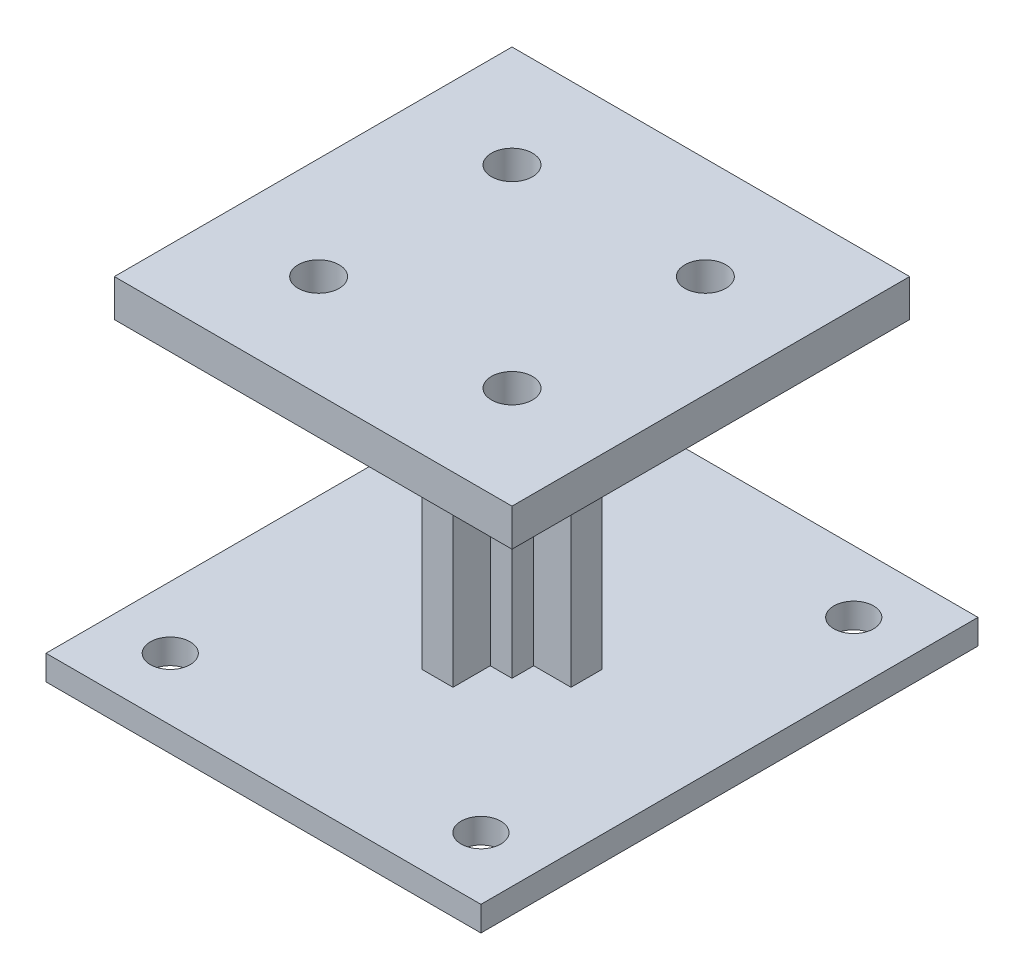
ISO-10303-21;
HEADER;
FILE_DESCRIPTION(('STEP AP214'),'2;1');
FILE_NAME('part.step','',(''),(''),'','','');
FILE_SCHEMA(('AUTOMOTIVE_DESIGN { 1 0 10303 214 1 1 1 1 }'));
ENDSEC;
DATA;
#1=APPLICATION_CONTEXT('core data for automotive mechanical design processes');
#2=APPLICATION_PROTOCOL_DEFINITION('international standard','automotive_design',2000,#1);
#3=PRODUCT_CONTEXT('',#1,'mechanical');
#4=PRODUCT('Part','Part','',(#3));
#5=PRODUCT_RELATED_PRODUCT_CATEGORY('part','',(#4));
#6=PRODUCT_DEFINITION_FORMATION('','',#4);
#7=PRODUCT_DEFINITION_CONTEXT('part definition',#1,'design');
#8=PRODUCT_DEFINITION('design','',#6,#7);
#9=PRODUCT_DEFINITION_SHAPE('','',#8);
#10=(LENGTH_UNIT() NAMED_UNIT(*) SI_UNIT(.MILLI.,.METRE.));
#11=(NAMED_UNIT(*) PLANE_ANGLE_UNIT() SI_UNIT($,.RADIAN.));
#12=(NAMED_UNIT(*) SI_UNIT($,.STERADIAN.) SOLID_ANGLE_UNIT());
#13=UNCERTAINTY_MEASURE_WITH_UNIT(LENGTH_MEASURE(1.E-05),#10,'distance_accuracy_value','');
#14=(GEOMETRIC_REPRESENTATION_CONTEXT(3) GLOBAL_UNCERTAINTY_ASSIGNED_CONTEXT((#13)) GLOBAL_UNIT_ASSIGNED_CONTEXT((#10,
#11,#12)) REPRESENTATION_CONTEXT('',''));
#15=CARTESIAN_POINT('',(0.,0.,0.));
#16=DIRECTION('',(0.,0.,1.));
#17=DIRECTION('',(1.,0.,0.));
#18=AXIS2_PLACEMENT_3D('',#15,#16,#17);
#19=CARTESIAN_POINT('',(0.,2.,0.));
#20=DIRECTION('',(0.,-1.,0.));
#21=DIRECTION('',(0.,0.,-1.));
#22=AXIS2_PLACEMENT_3D('',#19,#20,#21);
#23=PLANE('',#22);
#24=DIRECTION('',(0.,0.,-1.));
#25=VECTOR('',#24,1.);
#26=CARTESIAN_POINT('',(17.5,2.,20.));
#27=LINE('',#26,#25);
#28=CARTESIAN_POINT('',(17.5,2.,20.));
#29=VERTEX_POINT('',#28);
#30=CARTESIAN_POINT('',(17.5,2.,-20.));
#31=VERTEX_POINT('',#30);
#32=EDGE_CURVE('E536',#29,#31,#27,.T.);
#33=ORIENTED_EDGE('',*,*,#32,.T.);
#34=DIRECTION('',(-1.,0.,0.));
#35=VECTOR('',#34,1.);
#36=CARTESIAN_POINT('',(-17.5,2.,-20.));
#37=LINE('',#36,#35);
#38=CARTESIAN_POINT('',(-17.5,2.,-20.));
#39=VERTEX_POINT('',#38);
#40=EDGE_CURVE('E540',#31,#39,#37,.T.);
#41=ORIENTED_EDGE('',*,*,#40,.T.);
#42=DIRECTION('',(0.,0.,1.));
#43=VECTOR('',#42,1.);
#44=CARTESIAN_POINT('',(-17.5,2.,20.));
#45=LINE('',#44,#43);
#46=CARTESIAN_POINT('',(-17.5,2.,20.));
#47=VERTEX_POINT('',#46);
#48=EDGE_CURVE('E544',#39,#47,#45,.T.);
#49=ORIENTED_EDGE('',*,*,#48,.T.);
#50=DIRECTION('',(1.,0.,0.));
#51=VECTOR('',#50,1.);
#52=CARTESIAN_POINT('',(-17.5,2.,20.));
#53=LINE('',#52,#51);
#54=EDGE_CURVE('E547',#47,#29,#53,.T.);
#55=ORIENTED_EDGE('',*,*,#54,.T.);
#56=EDGE_LOOP('',(#33,#41,#49,#55));
#57=FACE_BOUND('',#56,.T.);
#58=CARTESIAN_POINT('',(-12.5,2.,-15.));
#59=DIRECTION('',(0.,1.,0.));
#60=DIRECTION('',(0.,0.,1.));
#61=AXIS2_PLACEMENT_3D('',#58,#59,#60);
#62=CIRCLE('',#61,1.6);
#63=CARTESIAN_POINT('',(-12.5,2.,-13.4));
#64=VERTEX_POINT('',#63);
#65=EDGE_CURVE('E508',#64,#64,#62,.T.);
#66=ORIENTED_EDGE('',*,*,#65,.F.);
#67=EDGE_LOOP('',(#66));
#68=FACE_BOUND('',#67,.T.);
#69=CARTESIAN_POINT('',(12.5,2.,-15.));
#70=DIRECTION('',(0.,1.,0.));
#71=DIRECTION('',(0.,0.,-1.));
#72=AXIS2_PLACEMENT_3D('',#69,#70,#71);
#73=CIRCLE('',#72,1.6);
#74=CARTESIAN_POINT('',(12.5,2.,-16.6));
#75=VERTEX_POINT('',#74);
#76=EDGE_CURVE('E504',#75,#75,#73,.T.);
#77=ORIENTED_EDGE('',*,*,#76,.F.);
#78=EDGE_LOOP('',(#77));
#79=FACE_BOUND('',#78,.T.);
#80=CARTESIAN_POINT('',(12.5,2.,15.));
#81=DIRECTION('',(0.,1.,0.));
#82=DIRECTION('',(0.,0.,1.));
#83=AXIS2_PLACEMENT_3D('',#80,#81,#82);
#84=CIRCLE('',#83,1.6);
#85=CARTESIAN_POINT('',(12.5,2.,16.6));
#86=VERTEX_POINT('',#85);
#87=EDGE_CURVE('E513',#86,#86,#84,.T.);
#88=ORIENTED_EDGE('',*,*,#87,.F.);
#89=EDGE_LOOP('',(#88));
#90=FACE_BOUND('',#89,.T.);
#91=CARTESIAN_POINT('',(-12.5,2.,15.));
#92=DIRECTION('',(0.,1.,0.));
#93=DIRECTION('',(0.,0.,-1.));
#94=AXIS2_PLACEMENT_3D('',#91,#92,#93);
#95=CIRCLE('',#94,1.6);
#96=CARTESIAN_POINT('',(-12.5,2.,13.4));
#97=VERTEX_POINT('',#96);
#98=EDGE_CURVE('E521',#97,#97,#95,.T.);
#99=ORIENTED_EDGE('',*,*,#98,.F.);
#100=EDGE_LOOP('',(#99));
#101=FACE_BOUND('',#100,.T.);
#102=DIRECTION('',(-1.,0.,0.));
#103=VECTOR('',#102,1.);
#104=CARTESIAN_POINT('',(6.,2.,-1.25000000000002));
#105=LINE('',#104,#103);
#106=CARTESIAN_POINT('',(6.,2.,-1.25000000000002));
#107=VERTEX_POINT('',#106);
#108=CARTESIAN_POINT('',(3.,2.,-1.25000000000002));
#109=VERTEX_POINT('',#108);
#110=EDGE_CURVE('E61',#107,#109,#105,.T.);
#111=ORIENTED_EDGE('',*,*,#110,.F.);
#112=DIRECTION('',(0.,0.,-1.));
#113=VECTOR('',#112,1.);
#114=CARTESIAN_POINT('',(6.,2.,1.24999999999998));
#115=LINE('',#114,#113);
#116=CARTESIAN_POINT('',(6.,2.,1.24999999999998));
#117=VERTEX_POINT('',#116);
#118=EDGE_CURVE('E65',#117,#107,#115,.T.);
#119=ORIENTED_EDGE('',*,*,#118,.F.);
#120=DIRECTION('',(-1.,0.,0.));
#121=VECTOR('',#120,1.);
#122=CARTESIAN_POINT('',(6.,2.,1.24999999999998));
#123=LINE('',#122,#121);
#124=CARTESIAN_POINT('',(3.,2.,1.24999999999999));
#125=VERTEX_POINT('',#124);
#126=EDGE_CURVE('E245',#117,#125,#123,.T.);
#127=ORIENTED_EDGE('',*,*,#126,.T.);
#128=DIRECTION('',(0.,0.,-1.));
#129=VECTOR('',#128,1.);
#130=CARTESIAN_POINT('',(3.,2.,3.));
#131=LINE('',#130,#129);
#132=CARTESIAN_POINT('',(3.,2.,3.));
#133=VERTEX_POINT('',#132);
#134=EDGE_CURVE('E231',#133,#125,#131,.T.);
#135=ORIENTED_EDGE('',*,*,#134,.F.);
#136=DIRECTION('',(1.,0.,0.));
#137=VECTOR('',#136,1.);
#138=CARTESIAN_POINT('',(-3.,2.,3.));
#139=LINE('',#138,#137);
#140=CARTESIAN_POINT('',(1.25,2.,3.));
#141=VERTEX_POINT('',#140);
#142=EDGE_CURVE('E484',#141,#133,#139,.T.);
#143=ORIENTED_EDGE('',*,*,#142,.F.);
#144=DIRECTION('',(0.,0.,-1.));
#145=VECTOR('',#144,1.);
#146=CARTESIAN_POINT('',(1.25,2.,6.));
#147=LINE('',#146,#145);
#148=CARTESIAN_POINT('',(1.25,2.,6.));
#149=VERTEX_POINT('',#148);
#150=EDGE_CURVE('E366',#149,#141,#147,.T.);
#151=ORIENTED_EDGE('',*,*,#150,.F.);
#152=DIRECTION('',(1.,0.,0.));
#153=VECTOR('',#152,1.);
#154=CARTESIAN_POINT('',(-1.25,2.,6.));
#155=LINE('',#154,#153);
#156=CARTESIAN_POINT('',(-1.25,2.,6.));
#157=VERTEX_POINT('',#156);
#158=EDGE_CURVE('E363',#157,#149,#155,.T.);
#159=ORIENTED_EDGE('',*,*,#158,.F.);
#160=DIRECTION('',(0.,0.,-1.));
#161=VECTOR('',#160,1.);
#162=CARTESIAN_POINT('',(-1.25,2.,6.));
#163=LINE('',#162,#161);
#164=CARTESIAN_POINT('',(-1.25,2.,3.));
#165=VERTEX_POINT('',#164);
#166=EDGE_CURVE('E373',#157,#165,#163,.T.);
#167=ORIENTED_EDGE('',*,*,#166,.T.);
#168=CARTESIAN_POINT('',(-3.,2.,3.));
#169=VERTEX_POINT('',#168);
#170=EDGE_CURVE('E485',#169,#165,#139,.T.);
#171=ORIENTED_EDGE('',*,*,#170,.F.);
#172=DIRECTION('',(0.,0.,1.));
#173=VECTOR('',#172,1.);
#174=CARTESIAN_POINT('',(-3.,2.,3.));
#175=LINE('',#174,#173);
#176=CARTESIAN_POINT('',(-3.,2.,1.25000000000006));
#177=VERTEX_POINT('',#176);
#178=EDGE_CURVE('E480',#177,#169,#175,.T.);
#179=ORIENTED_EDGE('',*,*,#178,.F.);
#180=DIRECTION('',(1.,0.,0.));
#181=VECTOR('',#180,1.);
#182=CARTESIAN_POINT('',(-5.99999999999999,2.,1.25000000000006));
#183=LINE('',#182,#181);
#184=CARTESIAN_POINT('',(-5.99999999999999,2.,1.25000000000006));
#185=VERTEX_POINT('',#184);
#186=EDGE_CURVE('E331',#185,#177,#183,.T.);
#187=ORIENTED_EDGE('',*,*,#186,.F.);
#188=DIRECTION('',(0.,0.,1.));
#189=VECTOR('',#188,1.);
#190=CARTESIAN_POINT('',(-6.00000000000001,2.,-1.24999999999994));
#191=LINE('',#190,#189);
#192=CARTESIAN_POINT('',(-6.00000000000001,2.,-1.24999999999994));
#193=VERTEX_POINT('',#192);
#194=EDGE_CURVE('E327',#193,#185,#191,.T.);
#195=ORIENTED_EDGE('',*,*,#194,.F.);
#196=DIRECTION('',(1.,0.,0.));
#197=VECTOR('',#196,1.);
#198=CARTESIAN_POINT('',(-6.00000000000001,2.,-1.24999999999994));
#199=LINE('',#198,#197);
#200=CARTESIAN_POINT('',(-3.00000000000001,2.,-1.24999999999997));
#201=VERTEX_POINT('',#200);
#202=EDGE_CURVE('E342',#193,#201,#199,.T.);
#203=ORIENTED_EDGE('',*,*,#202,.T.);
#204=CARTESIAN_POINT('',(-3.,2.,-3.));
#205=VERTEX_POINT('',#204);
#206=EDGE_CURVE('E481',#205,#201,#175,.T.);
#207=ORIENTED_EDGE('',*,*,#206,.F.);
#208=DIRECTION('',(-1.,0.,0.));
#209=VECTOR('',#208,1.);
#210=CARTESIAN_POINT('',(-3.,2.,-3.));
#211=LINE('',#210,#209);
#212=CARTESIAN_POINT('',(-1.25,2.,-3.));
#213=VERTEX_POINT('',#212);
#214=EDGE_CURVE('E241',#213,#205,#211,.T.);
#215=ORIENTED_EDGE('',*,*,#214,.F.);
#216=DIRECTION('',(0.,0.,1.));
#217=VECTOR('',#216,1.);
#218=CARTESIAN_POINT('',(-1.25,2.,-6.));
#219=LINE('',#218,#217);
#220=CARTESIAN_POINT('',(-1.25,2.,-6.));
#221=VERTEX_POINT('',#220);
#222=EDGE_CURVE('E292',#221,#213,#219,.T.);
#223=ORIENTED_EDGE('',*,*,#222,.F.);
#224=DIRECTION('',(-1.,0.,0.));
#225=VECTOR('',#224,1.);
#226=CARTESIAN_POINT('',(1.25,2.,-6.));
#227=LINE('',#226,#225);
#228=CARTESIAN_POINT('',(1.25,2.,-6.));
#229=VERTEX_POINT('',#228);
#230=EDGE_CURVE('E288',#229,#221,#227,.T.);
#231=ORIENTED_EDGE('',*,*,#230,.F.);
#232=DIRECTION('',(0.,0.,1.));
#233=VECTOR('',#232,1.);
#234=CARTESIAN_POINT('',(1.25,2.,-6.));
#235=LINE('',#234,#233);
#236=CARTESIAN_POINT('',(1.25,2.,-3.));
#237=VERTEX_POINT('',#236);
#238=EDGE_CURVE('E304',#229,#237,#235,.T.);
#239=ORIENTED_EDGE('',*,*,#238,.T.);
#240=CARTESIAN_POINT('',(3.,2.,-3.));
#241=VERTEX_POINT('',#240);
#242=EDGE_CURVE('E477',#241,#237,#211,.T.);
#243=ORIENTED_EDGE('',*,*,#242,.F.);
#244=EDGE_CURVE('E242',#109,#241,#131,.T.);
#245=ORIENTED_EDGE('',*,*,#244,.F.);
#246=EDGE_LOOP('',(#111,#119,#127,#135,#143,#151,#159,#167,#171,#179,#187,#195,#203,#207,#215,
#223,#231,#239,#243,#245));
#247=FACE_BOUND('',#246,.T.);
#248=ADVANCED_FACE('F45',(#57,#68,#79,#90,#101,#247),#23,.F.);
#249=CARTESIAN_POINT('',(0.,24.,0.));
#250=DIRECTION('',(0.,-1.,0.));
#251=DIRECTION('',(0.,0.,-1.));
#252=AXIS2_PLACEMENT_3D('',#249,#250,#251);
#253=PLANE('',#252);
#254=CARTESIAN_POINT('',(7.78,24.,7.78));
#255=DIRECTION('',(0.,1.,0.));
#256=DIRECTION('',(0.,0.,1.));
#257=AXIS2_PLACEMENT_3D('',#254,#255,#256);
#258=CIRCLE('',#257,1.65);
#259=CARTESIAN_POINT('',(7.78,24.,9.43000000000001));
#260=VERTEX_POINT('',#259);
#261=EDGE_CURVE('E389',#260,#260,#258,.T.);
#262=ORIENTED_EDGE('',*,*,#261,.T.);
#263=EDGE_LOOP('',(#262));
#264=FACE_BOUND('',#263,.T.);
#265=CARTESIAN_POINT('',(-7.78,24.,-7.78));
#266=DIRECTION('',(0.,1.,0.));
#267=DIRECTION('',(0.,0.,1.));
#268=AXIS2_PLACEMENT_3D('',#265,#266,#267);
#269=CIRCLE('',#268,1.65);
#270=CARTESIAN_POINT('',(-7.78,24.,-6.13));
#271=VERTEX_POINT('',#270);
#272=EDGE_CURVE('E405',#271,#271,#269,.T.);
#273=ORIENTED_EDGE('',*,*,#272,.T.);
#274=EDGE_LOOP('',(#273));
#275=FACE_BOUND('',#274,.T.);
#276=DIRECTION('',(0.,0.,-1.));
#277=VECTOR('',#276,1.);
#278=CARTESIAN_POINT('',(16.,24.,16.));
#279=LINE('',#278,#277);
#280=CARTESIAN_POINT('',(16.,24.,16.));
#281=VERTEX_POINT('',#280);
#282=CARTESIAN_POINT('',(16.,24.,-16.));
#283=VERTEX_POINT('',#282);
#284=EDGE_CURVE('E413',#281,#283,#279,.T.);
#285=ORIENTED_EDGE('',*,*,#284,.F.);
#286=DIRECTION('',(1.,0.,0.));
#287=VECTOR('',#286,1.);
#288=CARTESIAN_POINT('',(-16.,24.,16.));
#289=LINE('',#288,#287);
#290=CARTESIAN_POINT('',(-16.,24.,16.));
#291=VERTEX_POINT('',#290);
#292=EDGE_CURVE('E422',#291,#281,#289,.T.);
#293=ORIENTED_EDGE('',*,*,#292,.F.);
#294=DIRECTION('',(0.,0.,1.));
#295=VECTOR('',#294,1.);
#296=CARTESIAN_POINT('',(-16.,24.,16.));
#297=LINE('',#296,#295);
#298=CARTESIAN_POINT('',(-16.,24.,-16.));
#299=VERTEX_POINT('',#298);
#300=EDGE_CURVE('E438',#299,#291,#297,.T.);
#301=ORIENTED_EDGE('',*,*,#300,.F.);
#302=DIRECTION('',(-1.,0.,0.));
#303=VECTOR('',#302,1.);
#304=CARTESIAN_POINT('',(-16.,24.,-16.));
#305=LINE('',#304,#303);
#306=EDGE_CURVE('E435',#283,#299,#305,.T.);
#307=ORIENTED_EDGE('',*,*,#306,.F.);
#308=EDGE_LOOP('',(#285,#293,#301,#307));
#309=FACE_BOUND('',#308,.T.);
#310=CARTESIAN_POINT('',(7.78,24.,-7.78));
#311=DIRECTION('',(0.,1.,0.));
#312=DIRECTION('',(0.,0.,-1.));
#313=AXIS2_PLACEMENT_3D('',#310,#311,#312);
#314=CIRCLE('',#313,1.65);
#315=CARTESIAN_POINT('',(7.78,24.,-9.43000000000001));
#316=VERTEX_POINT('',#315);
#317=EDGE_CURVE('E397',#316,#316,#314,.T.);
#318=ORIENTED_EDGE('',*,*,#317,.T.);
#319=EDGE_LOOP('',(#318));
#320=FACE_BOUND('',#319,.T.);
#321=CARTESIAN_POINT('',(-7.78,24.,7.78));
#322=DIRECTION('',(0.,1.,0.));
#323=DIRECTION('',(0.,0.,-1.));
#324=AXIS2_PLACEMENT_3D('',#321,#322,#323);
#325=CIRCLE('',#324,1.65);
#326=CARTESIAN_POINT('',(-7.78,24.,6.13));
#327=VERTEX_POINT('',#326);
#328=EDGE_CURVE('E384',#327,#327,#325,.T.);
#329=ORIENTED_EDGE('',*,*,#328,.T.);
#330=EDGE_LOOP('',(#329));
#331=FACE_BOUND('',#330,.T.);
#332=DIRECTION('',(0.,0.,1.));
#333=VECTOR('',#332,1.);
#334=CARTESIAN_POINT('',(6.,24.,1.24999999999998));
#335=LINE('',#334,#333);
#336=CARTESIAN_POINT('',(6.,24.,-1.25000000000002));
#337=VERTEX_POINT('',#336);
#338=CARTESIAN_POINT('',(6.,24.,1.24999999999998));
#339=VERTEX_POINT('',#338);
#340=EDGE_CURVE('E260',#337,#339,#335,.T.);
#341=ORIENTED_EDGE('',*,*,#340,.F.);
#342=DIRECTION('',(-1.,0.,0.));
#343=VECTOR('',#342,1.);
#344=CARTESIAN_POINT('',(6.,24.,-1.25000000000002));
#345=LINE('',#344,#343);
#346=CARTESIAN_POINT('',(3.,24.,-1.25000000000002));
#347=VERTEX_POINT('',#346);
#348=EDGE_CURVE('E271',#337,#347,#345,.T.);
#349=ORIENTED_EDGE('',*,*,#348,.T.);
#350=DIRECTION('',(0.,0.,-1.));
#351=VECTOR('',#350,1.);
#352=CARTESIAN_POINT('',(3.,24.,3.));
#353=LINE('',#352,#351);
#354=CARTESIAN_POINT('',(3.,24.,-3.));
#355=VERTEX_POINT('',#354);
#356=EDGE_CURVE('E462',#347,#355,#353,.T.);
#357=ORIENTED_EDGE('',*,*,#356,.T.);
#358=DIRECTION('',(-1.,0.,0.));
#359=VECTOR('',#358,1.);
#360=CARTESIAN_POINT('',(-3.,24.,-3.));
#361=LINE('',#360,#359);
#362=CARTESIAN_POINT('',(1.25,24.,-3.));
#363=VERTEX_POINT('',#362);
#364=EDGE_CURVE('E463',#355,#363,#361,.T.);
#365=ORIENTED_EDGE('',*,*,#364,.T.);
#366=DIRECTION('',(0.,0.,1.));
#367=VECTOR('',#366,1.);
#368=CARTESIAN_POINT('',(1.25,24.,-6.));
#369=LINE('',#368,#367);
#370=CARTESIAN_POINT('',(1.25,24.,-6.));
#371=VERTEX_POINT('',#370);
#372=EDGE_CURVE('E308',#371,#363,#369,.T.);
#373=ORIENTED_EDGE('',*,*,#372,.F.);
#374=DIRECTION('',(1.,0.,0.));
#375=VECTOR('',#374,1.);
#376=CARTESIAN_POINT('',(1.25,24.,-6.));
#377=LINE('',#376,#375);
#378=CARTESIAN_POINT('',(-1.25,24.,-6.));
#379=VERTEX_POINT('',#378);
#380=EDGE_CURVE('E279',#379,#371,#377,.T.);
#381=ORIENTED_EDGE('',*,*,#380,.F.);
#382=DIRECTION('',(0.,0.,1.));
#383=VECTOR('',#382,1.);
#384=CARTESIAN_POINT('',(-1.25,24.,-6.));
#385=LINE('',#384,#383);
#386=CARTESIAN_POINT('',(-1.25,24.,-3.));
#387=VERTEX_POINT('',#386);
#388=EDGE_CURVE('E263',#379,#387,#385,.T.);
#389=ORIENTED_EDGE('',*,*,#388,.T.);
#390=CARTESIAN_POINT('',(-3.,24.,-3.));
#391=VERTEX_POINT('',#390);
#392=EDGE_CURVE('E461',#387,#391,#361,.T.);
#393=ORIENTED_EDGE('',*,*,#392,.T.);
#394=DIRECTION('',(0.,0.,1.));
#395=VECTOR('',#394,1.);
#396=CARTESIAN_POINT('',(-3.,24.,3.));
#397=LINE('',#396,#395);
#398=CARTESIAN_POINT('',(-3.,24.,-1.24999999999997));
#399=VERTEX_POINT('',#398);
#400=EDGE_CURVE('E468',#391,#399,#397,.T.);
#401=ORIENTED_EDGE('',*,*,#400,.T.);
#402=DIRECTION('',(1.,0.,0.));
#403=VECTOR('',#402,1.);
#404=CARTESIAN_POINT('',(-6.00000000000001,24.,-1.24999999999994));
#405=LINE('',#404,#403);
#406=CARTESIAN_POINT('',(-6.00000000000001,24.,-1.24999999999994));
#407=VERTEX_POINT('',#406);
#408=EDGE_CURVE('E346',#407,#399,#405,.T.);
#409=ORIENTED_EDGE('',*,*,#408,.F.);
#410=DIRECTION('',(0.,0.,-1.));
#411=VECTOR('',#410,1.);
#412=CARTESIAN_POINT('',(-6.00000000000001,24.,-1.24999999999994));
#413=LINE('',#412,#411);
#414=CARTESIAN_POINT('',(-5.99999999999999,24.,1.25000000000006));
#415=VERTEX_POINT('',#414);
#416=EDGE_CURVE('E318',#415,#407,#413,.T.);
#417=ORIENTED_EDGE('',*,*,#416,.F.);
#418=DIRECTION('',(1.,0.,0.));
#419=VECTOR('',#418,1.);
#420=CARTESIAN_POINT('',(-5.99999999999999,24.,1.25000000000006));
#421=LINE('',#420,#419);
#422=CARTESIAN_POINT('',(-3.,24.,1.25000000000006));
#423=VERTEX_POINT('',#422);
#424=EDGE_CURVE('E297',#415,#423,#421,.T.);
#425=ORIENTED_EDGE('',*,*,#424,.T.);
#426=CARTESIAN_POINT('',(-3.,24.,3.));
#427=VERTEX_POINT('',#426);
#428=EDGE_CURVE('E467',#423,#427,#397,.T.);
#429=ORIENTED_EDGE('',*,*,#428,.T.);
#430=DIRECTION('',(1.,0.,0.));
#431=VECTOR('',#430,1.);
#432=CARTESIAN_POINT('',(-3.,24.,3.));
#433=LINE('',#432,#431);
#434=CARTESIAN_POINT('',(-1.25,24.,3.));
#435=VERTEX_POINT('',#434);
#436=EDGE_CURVE('E473',#427,#435,#433,.T.);
#437=ORIENTED_EDGE('',*,*,#436,.T.);
#438=DIRECTION('',(0.,0.,-1.));
#439=VECTOR('',#438,1.);
#440=CARTESIAN_POINT('',(-1.25,24.,6.));
#441=LINE('',#440,#439);
#442=CARTESIAN_POINT('',(-1.25,24.,6.));
#443=VERTEX_POINT('',#442);
#444=EDGE_CURVE('E377',#443,#435,#441,.T.);
#445=ORIENTED_EDGE('',*,*,#444,.F.);
#446=DIRECTION('',(-1.,0.,0.));
#447=VECTOR('',#446,1.);
#448=CARTESIAN_POINT('',(-1.25,24.,6.));
#449=LINE('',#448,#447);
#450=CARTESIAN_POINT('',(1.25,24.,6.));
#451=VERTEX_POINT('',#450);
#452=EDGE_CURVE('E356',#451,#443,#449,.T.);
#453=ORIENTED_EDGE('',*,*,#452,.F.);
#454=DIRECTION('',(0.,0.,-1.));
#455=VECTOR('',#454,1.);
#456=CARTESIAN_POINT('',(1.25,24.,6.));
#457=LINE('',#456,#455);
#458=CARTESIAN_POINT('',(1.25,24.,3.));
#459=VERTEX_POINT('',#458);
#460=EDGE_CURVE('E380',#451,#459,#457,.T.);
#461=ORIENTED_EDGE('',*,*,#460,.T.);
#462=CARTESIAN_POINT('',(3.,24.,3.));
#463=VERTEX_POINT('',#462);
#464=EDGE_CURVE('E472',#459,#463,#433,.T.);
#465=ORIENTED_EDGE('',*,*,#464,.T.);
#466=CARTESIAN_POINT('',(3.,24.,1.24999999999999));
#467=VERTEX_POINT('',#466);
#468=EDGE_CURVE('E458',#463,#467,#353,.T.);
#469=ORIENTED_EDGE('',*,*,#468,.T.);
#470=DIRECTION('',(-1.,0.,0.));
#471=VECTOR('',#470,1.);
#472=CARTESIAN_POINT('',(6.,24.,1.24999999999998));
#473=LINE('',#472,#471);
#474=EDGE_CURVE('E249',#339,#467,#473,.T.);
#475=ORIENTED_EDGE('',*,*,#474,.F.);
#476=EDGE_LOOP('',(#341,#349,#357,#365,#373,#381,#389,#393,#401,#409,#417,#425,#429,#437,#445,
#453,#461,#465,#469,#475));
#477=FACE_BOUND('',#476,.T.);
#478=ADVANCED_FACE('F599',(#264,#275,#309,#320,#331,#477),#253,.T.);
#479=CARTESIAN_POINT('',(3.,24.,3.));
#480=DIRECTION('',(-1.,0.,0.));
#481=DIRECTION('',(0.,0.,1.));
#482=AXIS2_PLACEMENT_3D('',#479,#480,#481);
#483=PLANE('',#482);
#484=DIRECTION('',(0.,1.,0.));
#485=VECTOR('',#484,1.);
#486=CARTESIAN_POINT('',(3.,2.,-1.25000000000001));
#487=LINE('',#486,#485);
#488=EDGE_CURVE('E255',#109,#347,#487,.T.);
#489=ORIENTED_EDGE('',*,*,#488,.F.);
#490=ORIENTED_EDGE('',*,*,#244,.T.);
#491=DIRECTION('',(0.,-1.,0.));
#492=VECTOR('',#491,1.);
#493=CARTESIAN_POINT('',(3.,24.,-3.));
#494=LINE('',#493,#492);
#495=EDGE_CURVE('E499',#355,#241,#494,.T.);
#496=ORIENTED_EDGE('',*,*,#495,.F.);
#497=ORIENTED_EDGE('',*,*,#356,.F.);
#498=EDGE_LOOP('',(#489,#490,#496,#497));
#499=FACE_BOUND('',#498,.T.);
#500=ADVANCED_FACE('F605',(#499),#483,.F.);
#501=DIRECTION('',(0.,-1.,0.));
#502=VECTOR('',#501,1.);
#503=CARTESIAN_POINT('',(3.,2.,1.24999999999999));
#504=LINE('',#503,#502);
#505=EDGE_CURVE('E235',#467,#125,#504,.T.);
#506=ORIENTED_EDGE('',*,*,#505,.F.);
#507=ORIENTED_EDGE('',*,*,#468,.F.);
#508=DIRECTION('',(0.,-1.,0.));
#509=VECTOR('',#508,1.);
#510=CARTESIAN_POINT('',(3.,24.,3.));
#511=LINE('',#510,#509);
#512=EDGE_CURVE('E238',#463,#133,#511,.T.);
#513=ORIENTED_EDGE('',*,*,#512,.T.);
#514=ORIENTED_EDGE('',*,*,#134,.T.);
#515=EDGE_LOOP('',(#506,#507,#513,#514));
#516=FACE_BOUND('',#515,.T.);
#517=ADVANCED_FACE('F232',(#516),#483,.F.);
#518=CARTESIAN_POINT('',(-3.,24.,-3.));
#519=DIRECTION('',(0.,0.,1.));
#520=DIRECTION('',(1.,0.,0.));
#521=AXIS2_PLACEMENT_3D('',#518,#519,#520);
#522=PLANE('',#521);
#523=DIRECTION('',(0.,1.,0.));
#524=VECTOR('',#523,1.);
#525=CARTESIAN_POINT('',(-1.25,2.,-3.));
#526=LINE('',#525,#524);
#527=EDGE_CURVE('E293',#213,#387,#526,.T.);
#528=ORIENTED_EDGE('',*,*,#527,.F.);
#529=ORIENTED_EDGE('',*,*,#214,.T.);
#530=DIRECTION('',(0.,-1.,0.));
#531=VECTOR('',#530,1.);
#532=CARTESIAN_POINT('',(-3.,24.,-3.));
#533=LINE('',#532,#531);
#534=EDGE_CURVE('E495',#391,#205,#533,.T.);
#535=ORIENTED_EDGE('',*,*,#534,.F.);
#536=ORIENTED_EDGE('',*,*,#392,.F.);
#537=EDGE_LOOP('',(#528,#529,#535,#536));
#538=FACE_BOUND('',#537,.T.);
#539=ADVANCED_FACE('F808',(#538),#522,.F.);
#540=DIRECTION('',(0.,-1.,0.));
#541=VECTOR('',#540,1.);
#542=CARTESIAN_POINT('',(1.25,2.,-3.));
#543=LINE('',#542,#541);
#544=EDGE_CURVE('E280',#363,#237,#543,.T.);
#545=ORIENTED_EDGE('',*,*,#544,.F.);
#546=ORIENTED_EDGE('',*,*,#364,.F.);
#547=ORIENTED_EDGE('',*,*,#495,.T.);
#548=ORIENTED_EDGE('',*,*,#242,.T.);
#549=EDGE_LOOP('',(#545,#546,#547,#548));
#550=FACE_BOUND('',#549,.T.);
#551=ADVANCED_FACE('F800',(#550),#522,.F.);
#552=CARTESIAN_POINT('',(-3.,24.,3.));
#553=DIRECTION('',(1.,0.,0.));
#554=DIRECTION('',(0.,0.,-1.));
#555=AXIS2_PLACEMENT_3D('',#552,#553,#554);
#556=PLANE('',#555);
#557=DIRECTION('',(0.,1.,0.));
#558=VECTOR('',#557,1.);
#559=CARTESIAN_POINT('',(-2.99999999999999,2.,1.25000000000003));
#560=LINE('',#559,#558);
#561=EDGE_CURVE('E332',#177,#423,#560,.T.);
#562=ORIENTED_EDGE('',*,*,#561,.F.);
#563=ORIENTED_EDGE('',*,*,#178,.T.);
#564=DIRECTION('',(0.,-1.,0.));
#565=VECTOR('',#564,1.);
#566=CARTESIAN_POINT('',(-3.,24.,3.));
#567=LINE('',#566,#565);
#568=EDGE_CURVE('E491',#427,#169,#567,.T.);
#569=ORIENTED_EDGE('',*,*,#568,.F.);
#570=ORIENTED_EDGE('',*,*,#428,.F.);
#571=EDGE_LOOP('',(#562,#563,#569,#570));
#572=FACE_BOUND('',#571,.T.);
#573=ADVANCED_FACE('F791',(#572),#556,.F.);
#574=DIRECTION('',(0.,-1.,0.));
#575=VECTOR('',#574,1.);
#576=CARTESIAN_POINT('',(-3.00000000000001,2.,-1.24999999999997));
#577=LINE('',#576,#575);
#578=EDGE_CURVE('E319',#399,#201,#577,.T.);
#579=ORIENTED_EDGE('',*,*,#578,.F.);
#580=ORIENTED_EDGE('',*,*,#400,.F.);
#581=ORIENTED_EDGE('',*,*,#534,.T.);
#582=ORIENTED_EDGE('',*,*,#206,.T.);
#583=EDGE_LOOP('',(#579,#580,#581,#582));
#584=FACE_BOUND('',#583,.T.);
#585=ADVANCED_FACE('F749',(#584),#556,.F.);
#586=CARTESIAN_POINT('',(-3.,24.,3.));
#587=DIRECTION('',(0.,0.,-1.));
#588=DIRECTION('',(-1.,0.,0.));
#589=AXIS2_PLACEMENT_3D('',#586,#587,#588);
#590=PLANE('',#589);
#591=DIRECTION('',(0.,1.,0.));
#592=VECTOR('',#591,1.);
#593=CARTESIAN_POINT('',(1.25,2.,3.));
#594=LINE('',#593,#592);
#595=EDGE_CURVE('E274',#141,#459,#594,.T.);
#596=ORIENTED_EDGE('',*,*,#595,.F.);
#597=ORIENTED_EDGE('',*,*,#142,.T.);
#598=ORIENTED_EDGE('',*,*,#512,.F.);
#599=ORIENTED_EDGE('',*,*,#464,.F.);
#600=EDGE_LOOP('',(#596,#597,#598,#599));
#601=FACE_BOUND('',#600,.T.);
#602=ADVANCED_FACE('F745',(#601),#590,.F.);
#603=DIRECTION('',(0.,-1.,0.));
#604=VECTOR('',#603,1.);
#605=CARTESIAN_POINT('',(-1.25,2.,3.));
#606=LINE('',#605,#604);
#607=EDGE_CURVE('E357',#435,#165,#606,.T.);
#608=ORIENTED_EDGE('',*,*,#607,.F.);
#609=ORIENTED_EDGE('',*,*,#436,.F.);
#610=ORIENTED_EDGE('',*,*,#568,.T.);
#611=ORIENTED_EDGE('',*,*,#170,.T.);
#612=EDGE_LOOP('',(#608,#609,#610,#611));
#613=FACE_BOUND('',#612,.T.);
#614=ADVANCED_FACE('F597',(#613),#590,.F.);
#615=CARTESIAN_POINT('',(17.5,2.,20.));
#616=DIRECTION('',(-1.,0.,0.));
#617=DIRECTION('',(0.,0.,1.));
#618=AXIS2_PLACEMENT_3D('',#615,#616,#617);
#619=PLANE('',#618);
#620=DIRECTION('',(0.,0.,-1.));
#621=VECTOR('',#620,1.);
#622=CARTESIAN_POINT('',(17.5,0.,20.));
#623=LINE('',#622,#621);
#624=CARTESIAN_POINT('',(17.5,0.,20.));
#625=VERTEX_POINT('',#624);
#626=CARTESIAN_POINT('',(17.5,0.,-20.));
#627=VERTEX_POINT('',#626);
#628=EDGE_CURVE('E532',#625,#627,#623,.T.);
#629=ORIENTED_EDGE('',*,*,#628,.T.);
#630=DIRECTION('',(0.,-1.,0.));
#631=VECTOR('',#630,1.);
#632=CARTESIAN_POINT('',(17.5,2.,-20.));
#633=LINE('',#632,#631);
#634=EDGE_CURVE('E11',#31,#627,#633,.T.);
#635=ORIENTED_EDGE('',*,*,#634,.F.);
#636=ORIENTED_EDGE('',*,*,#32,.F.);
#637=DIRECTION('',(0.,-1.,0.));
#638=VECTOR('',#637,1.);
#639=CARTESIAN_POINT('',(17.5,2.,20.));
#640=LINE('',#639,#638);
#641=EDGE_CURVE('E550',#29,#625,#640,.T.);
#642=ORIENTED_EDGE('',*,*,#641,.T.);
#643=EDGE_LOOP('',(#629,#635,#636,#642));
#644=FACE_BOUND('',#643,.T.);
#645=ADVANCED_FACE('F47',(#644),#619,.F.);
#646=CARTESIAN_POINT('',(-17.5,2.,-20.));
#647=DIRECTION('',(0.,0.,1.));
#648=DIRECTION('',(1.,0.,0.));
#649=AXIS2_PLACEMENT_3D('',#646,#647,#648);
#650=PLANE('',#649);
#651=DIRECTION('',(-1.,0.,0.));
#652=VECTOR('',#651,1.);
#653=CARTESIAN_POINT('',(-17.5,0.,-20.));
#654=LINE('',#653,#652);
#655=CARTESIAN_POINT('',(-17.5,0.,-20.));
#656=VERTEX_POINT('',#655);
#657=EDGE_CURVE('E554',#627,#656,#654,.T.);
#658=ORIENTED_EDGE('',*,*,#657,.T.);
#659=DIRECTION('',(0.,-1.,0.));
#660=VECTOR('',#659,1.);
#661=CARTESIAN_POINT('',(-17.5,2.,-20.));
#662=LINE('',#661,#660);
#663=EDGE_CURVE('E54',#39,#656,#662,.T.);
#664=ORIENTED_EDGE('',*,*,#663,.F.);
#665=ORIENTED_EDGE('',*,*,#40,.F.);
#666=ORIENTED_EDGE('',*,*,#634,.T.);
#667=EDGE_LOOP('',(#658,#664,#665,#666));
#668=FACE_BOUND('',#667,.T.);
#669=ADVANCED_FACE('F590',(#668),#650,.F.);
#670=CARTESIAN_POINT('',(-17.5,2.,20.));
#671=DIRECTION('',(1.,0.,0.));
#672=DIRECTION('',(0.,0.,-1.));
#673=AXIS2_PLACEMENT_3D('',#670,#671,#672);
#674=PLANE('',#673);
#675=DIRECTION('',(0.,0.,1.));
#676=VECTOR('',#675,1.);
#677=CARTESIAN_POINT('',(-17.5,0.,20.));
#678=LINE('',#677,#676);
#679=CARTESIAN_POINT('',(-17.5,0.,20.));
#680=VERTEX_POINT('',#679);
#681=EDGE_CURVE('E557',#656,#680,#678,.T.);
#682=ORIENTED_EDGE('',*,*,#681,.T.);
#683=DIRECTION('',(0.,-1.,0.));
#684=VECTOR('',#683,1.);
#685=CARTESIAN_POINT('',(-17.5,2.,20.));
#686=LINE('',#685,#684);
#687=EDGE_CURVE('E565',#47,#680,#686,.T.);
#688=ORIENTED_EDGE('',*,*,#687,.F.);
#689=ORIENTED_EDGE('',*,*,#48,.F.);
#690=ORIENTED_EDGE('',*,*,#663,.T.);
#691=EDGE_LOOP('',(#682,#688,#689,#690));
#692=FACE_BOUND('',#691,.T.);
#693=ADVANCED_FACE('F574',(#692),#674,.F.);
#694=CARTESIAN_POINT('',(-17.5,2.,20.));
#695=DIRECTION('',(0.,0.,-1.));
#696=DIRECTION('',(-1.,0.,0.));
#697=AXIS2_PLACEMENT_3D('',#694,#695,#696);
#698=PLANE('',#697);
#699=DIRECTION('',(1.,0.,0.));
#700=VECTOR('',#699,1.);
#701=CARTESIAN_POINT('',(-17.5,0.,20.));
#702=LINE('',#701,#700);
#703=EDGE_CURVE('E541',#680,#625,#702,.T.);
#704=ORIENTED_EDGE('',*,*,#703,.T.);
#705=ORIENTED_EDGE('',*,*,#641,.F.);
#706=ORIENTED_EDGE('',*,*,#54,.F.);
#707=ORIENTED_EDGE('',*,*,#687,.T.);
#708=EDGE_LOOP('',(#704,#705,#706,#707));
#709=FACE_BOUND('',#708,.T.);
#710=ADVANCED_FACE('F583',(#709),#698,.F.);
#711=CARTESIAN_POINT('',(0.,0.,0.));
#712=DIRECTION('',(0.,-1.,0.));
#713=DIRECTION('',(0.,0.,-1.));
#714=AXIS2_PLACEMENT_3D('',#711,#712,#713);
#715=PLANE('',#714);
#716=CARTESIAN_POINT('',(-12.5,0.,15.));
#717=DIRECTION('',(0.,1.,0.));
#718=DIRECTION('',(0.,0.,-1.));
#719=AXIS2_PLACEMENT_3D('',#716,#717,#718);
#720=CIRCLE('',#719,1.6);
#721=CARTESIAN_POINT('',(-12.5,0.,13.4));
#722=VERTEX_POINT('',#721);
#723=EDGE_CURVE('E503',#722,#722,#720,.T.);
#724=ORIENTED_EDGE('',*,*,#723,.T.);
#725=EDGE_LOOP('',(#724));
#726=FACE_BOUND('',#725,.T.);
#727=CARTESIAN_POINT('',(12.5,0.,15.));
#728=DIRECTION('',(0.,1.,0.));
#729=DIRECTION('',(0.,0.,1.));
#730=AXIS2_PLACEMENT_3D('',#727,#728,#729);
#731=CIRCLE('',#730,1.6);
#732=CARTESIAN_POINT('',(12.5,0.,16.6));
#733=VERTEX_POINT('',#732);
#734=EDGE_CURVE('E517',#733,#733,#731,.T.);
#735=ORIENTED_EDGE('',*,*,#734,.T.);
#736=EDGE_LOOP('',(#735));
#737=FACE_BOUND('',#736,.T.);
#738=CARTESIAN_POINT('',(12.5,0.,-15.));
#739=DIRECTION('',(0.,1.,0.));
#740=DIRECTION('',(0.,0.,-1.));
#741=AXIS2_PLACEMENT_3D('',#738,#739,#740);
#742=CIRCLE('',#741,1.6);
#743=CARTESIAN_POINT('',(12.5,0.,-16.6));
#744=VERTEX_POINT('',#743);
#745=EDGE_CURVE('E509',#744,#744,#742,.T.);
#746=ORIENTED_EDGE('',*,*,#745,.T.);
#747=EDGE_LOOP('',(#746));
#748=FACE_BOUND('',#747,.T.);
#749=CARTESIAN_POINT('',(-12.5,0.,-15.));
#750=DIRECTION('',(0.,1.,0.));
#751=DIRECTION('',(0.,0.,1.));
#752=AXIS2_PLACEMENT_3D('',#749,#750,#751);
#753=CIRCLE('',#752,1.6);
#754=CARTESIAN_POINT('',(-12.5,0.,-13.4));
#755=VERTEX_POINT('',#754);
#756=EDGE_CURVE('E528',#755,#755,#753,.T.);
#757=ORIENTED_EDGE('',*,*,#756,.T.);
#758=EDGE_LOOP('',(#757));
#759=FACE_BOUND('',#758,.T.);
#760=ORIENTED_EDGE('',*,*,#628,.F.);
#761=ORIENTED_EDGE('',*,*,#703,.F.);
#762=ORIENTED_EDGE('',*,*,#681,.F.);
#763=ORIENTED_EDGE('',*,*,#657,.F.);
#764=EDGE_LOOP('',(#760,#761,#762,#763));
#765=FACE_BOUND('',#764,.T.);
#766=ADVANCED_FACE('F580',(#726,#737,#748,#759,#765),#715,.T.);
#767=CARTESIAN_POINT('',(-12.5,0.,-15.));
#768=DIRECTION('',(0.,1.,0.));
#769=DIRECTION('',(0.,0.,1.));
#770=AXIS2_PLACEMENT_3D('',#767,#768,#769);
#771=CYLINDRICAL_SURFACE('',#770,1.6);
#772=ORIENTED_EDGE('',*,*,#756,.F.);
#773=EDGE_LOOP('',(#772));
#774=FACE_BOUND('',#773,.T.);
#775=ORIENTED_EDGE('',*,*,#65,.T.);
#776=EDGE_LOOP('',(#775));
#777=FACE_BOUND('',#776,.T.);
#778=ADVANCED_FACE('F610',(#774,#777),#771,.F.);
#779=CARTESIAN_POINT('',(12.5,0.,-15.));
#780=DIRECTION('',(0.,1.,0.));
#781=DIRECTION('',(0.,0.,1.));
#782=AXIS2_PLACEMENT_3D('',#779,#780,#781);
#783=CYLINDRICAL_SURFACE('',#782,1.6);
#784=ORIENTED_EDGE('',*,*,#745,.F.);
#785=EDGE_LOOP('',(#784));
#786=FACE_BOUND('',#785,.T.);
#787=ORIENTED_EDGE('',*,*,#76,.T.);
#788=EDGE_LOOP('',(#787));
#789=FACE_BOUND('',#788,.T.);
#790=ADVANCED_FACE('F632',(#786,#789),#783,.F.);
#791=CARTESIAN_POINT('',(12.5,0.,15.));
#792=DIRECTION('',(0.,1.,0.));
#793=DIRECTION('',(0.,0.,1.));
#794=AXIS2_PLACEMENT_3D('',#791,#792,#793);
#795=CYLINDRICAL_SURFACE('',#794,1.6);
#796=ORIENTED_EDGE('',*,*,#734,.F.);
#797=EDGE_LOOP('',(#796));
#798=FACE_BOUND('',#797,.T.);
#799=ORIENTED_EDGE('',*,*,#87,.T.);
#800=EDGE_LOOP('',(#799));
#801=FACE_BOUND('',#800,.T.);
#802=ADVANCED_FACE('F640',(#798,#801),#795,.F.);
#803=CARTESIAN_POINT('',(-12.5,0.,15.));
#804=DIRECTION('',(0.,1.,0.));
#805=DIRECTION('',(0.,0.,1.));
#806=AXIS2_PLACEMENT_3D('',#803,#804,#805);
#807=CYLINDRICAL_SURFACE('',#806,1.6);
#808=ORIENTED_EDGE('',*,*,#723,.F.);
#809=EDGE_LOOP('',(#808));
#810=FACE_BOUND('',#809,.T.);
#811=ORIENTED_EDGE('',*,*,#98,.T.);
#812=EDGE_LOOP('',(#811));
#813=FACE_BOUND('',#812,.T.);
#814=ADVANCED_FACE('F649',(#810,#813),#807,.F.);
#815=CARTESIAN_POINT('',(0.,27.,0.));
#816=DIRECTION('',(0.,-1.,0.));
#817=DIRECTION('',(0.,0.,-1.));
#818=AXIS2_PLACEMENT_3D('',#815,#816,#817);
#819=PLANE('',#818);
#820=DIRECTION('',(0.,0.,-1.));
#821=VECTOR('',#820,1.);
#822=CARTESIAN_POINT('',(16.,27.,16.));
#823=LINE('',#822,#821);
#824=CARTESIAN_POINT('',(16.,27.,16.));
#825=VERTEX_POINT('',#824);
#826=CARTESIAN_POINT('',(16.,27.,-16.));
#827=VERTEX_POINT('',#826);
#828=EDGE_CURVE('E417',#825,#827,#823,.T.);
#829=ORIENTED_EDGE('',*,*,#828,.T.);
#830=DIRECTION('',(-1.,0.,0.));
#831=VECTOR('',#830,1.);
#832=CARTESIAN_POINT('',(-16.,27.,-16.));
#833=LINE('',#832,#831);
#834=CARTESIAN_POINT('',(-16.,27.,-16.));
#835=VERTEX_POINT('',#834);
#836=EDGE_CURVE('E421',#827,#835,#833,.T.);
#837=ORIENTED_EDGE('',*,*,#836,.T.);
#838=DIRECTION('',(0.,0.,1.));
#839=VECTOR('',#838,1.);
#840=CARTESIAN_POINT('',(-16.,27.,16.));
#841=LINE('',#840,#839);
#842=CARTESIAN_POINT('',(-16.,27.,16.));
#843=VERTEX_POINT('',#842);
#844=EDGE_CURVE('E425',#835,#843,#841,.T.);
#845=ORIENTED_EDGE('',*,*,#844,.T.);
#846=DIRECTION('',(1.,0.,0.));
#847=VECTOR('',#846,1.);
#848=CARTESIAN_POINT('',(-16.,27.,16.));
#849=LINE('',#848,#847);
#850=EDGE_CURVE('E428',#843,#825,#849,.T.);
#851=ORIENTED_EDGE('',*,*,#850,.T.);
#852=EDGE_LOOP('',(#829,#837,#845,#851));
#853=FACE_BOUND('',#852,.T.);
#854=CARTESIAN_POINT('',(-7.78,27.,-7.78));
#855=DIRECTION('',(0.,1.,0.));
#856=DIRECTION('',(0.,0.,1.));
#857=AXIS2_PLACEMENT_3D('',#854,#855,#856);
#858=CIRCLE('',#857,1.65);
#859=CARTESIAN_POINT('',(-7.78,27.,-6.13));
#860=VERTEX_POINT('',#859);
#861=EDGE_CURVE('E409',#860,#860,#858,.T.);
#862=ORIENTED_EDGE('',*,*,#861,.F.);
#863=EDGE_LOOP('',(#862));
#864=FACE_BOUND('',#863,.T.);
#865=CARTESIAN_POINT('',(7.78,27.,-7.78));
#866=DIRECTION('',(0.,1.,0.));
#867=DIRECTION('',(0.,0.,-1.));
#868=AXIS2_PLACEMENT_3D('',#865,#866,#867);
#869=CIRCLE('',#868,1.65);
#870=CARTESIAN_POINT('',(7.78,27.,-9.43000000000001));
#871=VERTEX_POINT('',#870);
#872=EDGE_CURVE('E401',#871,#871,#869,.T.);
#873=ORIENTED_EDGE('',*,*,#872,.F.);
#874=EDGE_LOOP('',(#873));
#875=FACE_BOUND('',#874,.T.);
#876=CARTESIAN_POINT('',(7.78,27.,7.78));
#877=DIRECTION('',(0.,1.,0.));
#878=DIRECTION('',(0.,0.,1.));
#879=AXIS2_PLACEMENT_3D('',#876,#877,#878);
#880=CIRCLE('',#879,1.65);
#881=CARTESIAN_POINT('',(7.78,27.,9.43000000000001));
#882=VERTEX_POINT('',#881);
#883=EDGE_CURVE('E393',#882,#882,#880,.T.);
#884=ORIENTED_EDGE('',*,*,#883,.F.);
#885=EDGE_LOOP('',(#884));
#886=FACE_BOUND('',#885,.T.);
#887=CARTESIAN_POINT('',(-7.78,27.,7.78));
#888=DIRECTION('',(0.,1.,0.));
#889=DIRECTION('',(0.,0.,-1.));
#890=AXIS2_PLACEMENT_3D('',#887,#888,#889);
#891=CIRCLE('',#890,1.65);
#892=CARTESIAN_POINT('',(-7.78,27.,6.13));
#893=VERTEX_POINT('',#892);
#894=EDGE_CURVE('E385',#893,#893,#891,.T.);
#895=ORIENTED_EDGE('',*,*,#894,.F.);
#896=EDGE_LOOP('',(#895));
#897=FACE_BOUND('',#896,.T.);
#898=ADVANCED_FACE('F658',(#853,#864,#875,#886,#897),#819,.F.);
#899=CARTESIAN_POINT('',(16.,27.,16.));
#900=DIRECTION('',(-1.,0.,0.));
#901=DIRECTION('',(0.,0.,1.));
#902=AXIS2_PLACEMENT_3D('',#899,#900,#901);
#903=PLANE('',#902);
#904=ORIENTED_EDGE('',*,*,#284,.T.);
#905=DIRECTION('',(0.,-1.,0.));
#906=VECTOR('',#905,1.);
#907=CARTESIAN_POINT('',(16.,27.,-16.));
#908=LINE('',#907,#906);
#909=EDGE_CURVE('E454',#827,#283,#908,.T.);
#910=ORIENTED_EDGE('',*,*,#909,.F.);
#911=ORIENTED_EDGE('',*,*,#828,.F.);
#912=DIRECTION('',(0.,-1.,0.));
#913=VECTOR('',#912,1.);
#914=CARTESIAN_POINT('',(16.,27.,16.));
#915=LINE('',#914,#913);
#916=EDGE_CURVE('E431',#825,#281,#915,.T.);
#917=ORIENTED_EDGE('',*,*,#916,.T.);
#918=EDGE_LOOP('',(#904,#910,#911,#917));
#919=FACE_BOUND('',#918,.T.);
#920=ADVANCED_FACE('F666',(#919),#903,.F.);
#921=CARTESIAN_POINT('',(-16.,27.,-16.));
#922=DIRECTION('',(0.,0.,1.));
#923=DIRECTION('',(1.,0.,0.));
#924=AXIS2_PLACEMENT_3D('',#921,#922,#923);
#925=PLANE('',#924);
#926=ORIENTED_EDGE('',*,*,#306,.T.);
#927=DIRECTION('',(0.,-1.,0.));
#928=VECTOR('',#927,1.);
#929=CARTESIAN_POINT('',(-16.,27.,-16.));
#930=LINE('',#929,#928);
#931=EDGE_CURVE('E450',#835,#299,#930,.T.);
#932=ORIENTED_EDGE('',*,*,#931,.F.);
#933=ORIENTED_EDGE('',*,*,#836,.F.);
#934=ORIENTED_EDGE('',*,*,#909,.T.);
#935=EDGE_LOOP('',(#926,#932,#933,#934));
#936=FACE_BOUND('',#935,.T.);
#937=ADVANCED_FACE('F675',(#936),#925,.F.);
#938=CARTESIAN_POINT('',(-16.,27.,16.));
#939=DIRECTION('',(1.,0.,0.));
#940=DIRECTION('',(0.,0.,-1.));
#941=AXIS2_PLACEMENT_3D('',#938,#939,#940);
#942=PLANE('',#941);
#943=ORIENTED_EDGE('',*,*,#300,.T.);
#944=DIRECTION('',(0.,-1.,0.));
#945=VECTOR('',#944,1.);
#946=CARTESIAN_POINT('',(-16.,27.,16.));
#947=LINE('',#946,#945);
#948=EDGE_CURVE('E446',#843,#291,#947,.T.);
#949=ORIENTED_EDGE('',*,*,#948,.F.);
#950=ORIENTED_EDGE('',*,*,#844,.F.);
#951=ORIENTED_EDGE('',*,*,#931,.T.);
#952=EDGE_LOOP('',(#943,#949,#950,#951));
#953=FACE_BOUND('',#952,.T.);
#954=ADVANCED_FACE('F684',(#953),#942,.F.);
#955=CARTESIAN_POINT('',(-16.,27.,16.));
#956=DIRECTION('',(0.,0.,-1.));
#957=DIRECTION('',(-1.,0.,0.));
#958=AXIS2_PLACEMENT_3D('',#955,#956,#957);
#959=PLANE('',#958);
#960=ORIENTED_EDGE('',*,*,#292,.T.);
#961=ORIENTED_EDGE('',*,*,#916,.F.);
#962=ORIENTED_EDGE('',*,*,#850,.F.);
#963=ORIENTED_EDGE('',*,*,#948,.T.);
#964=EDGE_LOOP('',(#960,#961,#962,#963));
#965=FACE_BOUND('',#964,.T.);
#966=ADVANCED_FACE('F693',(#965),#959,.F.);
#967=CARTESIAN_POINT('',(-7.78,27.,-7.78));
#968=DIRECTION('',(0.,-1.,0.));
#969=DIRECTION('',(0.,0.,-1.));
#970=AXIS2_PLACEMENT_3D('',#967,#968,#969);
#971=CYLINDRICAL_SURFACE('',#970,1.65);
#972=ORIENTED_EDGE('',*,*,#861,.T.);
#973=EDGE_LOOP('',(#972));
#974=FACE_BOUND('',#973,.T.);
#975=ORIENTED_EDGE('',*,*,#272,.F.);
#976=EDGE_LOOP('',(#975));
#977=FACE_BOUND('',#976,.T.);
#978=ADVANCED_FACE('F702',(#974,#977),#971,.F.);
#979=CARTESIAN_POINT('',(7.78,27.,-7.78));
#980=DIRECTION('',(0.,-1.,0.));
#981=DIRECTION('',(0.,0.,-1.));
#982=AXIS2_PLACEMENT_3D('',#979,#980,#981);
#983=CYLINDRICAL_SURFACE('',#982,1.65);
#984=ORIENTED_EDGE('',*,*,#872,.T.);
#985=EDGE_LOOP('',(#984));
#986=FACE_BOUND('',#985,.T.);
#987=ORIENTED_EDGE('',*,*,#317,.F.);
#988=EDGE_LOOP('',(#987));
#989=FACE_BOUND('',#988,.T.);
#990=ADVANCED_FACE('F711',(#986,#989),#983,.F.);
#991=CARTESIAN_POINT('',(7.78,27.,7.78));
#992=DIRECTION('',(0.,-1.,0.));
#993=DIRECTION('',(0.,0.,-1.));
#994=AXIS2_PLACEMENT_3D('',#991,#992,#993);
#995=CYLINDRICAL_SURFACE('',#994,1.65);
#996=ORIENTED_EDGE('',*,*,#883,.T.);
#997=EDGE_LOOP('',(#996));
#998=FACE_BOUND('',#997,.T.);
#999=ORIENTED_EDGE('',*,*,#261,.F.);
#1000=EDGE_LOOP('',(#999));
#1001=FACE_BOUND('',#1000,.T.);
#1002=ADVANCED_FACE('F720',(#998,#1001),#995,.F.);
#1003=CARTESIAN_POINT('',(-7.78,27.,7.78));
#1004=DIRECTION('',(0.,-1.,0.));
#1005=DIRECTION('',(0.,0.,-1.));
#1006=AXIS2_PLACEMENT_3D('',#1003,#1004,#1005);
#1007=CYLINDRICAL_SURFACE('',#1006,1.65);
#1008=ORIENTED_EDGE('',*,*,#894,.T.);
#1009=EDGE_LOOP('',(#1008));
#1010=FACE_BOUND('',#1009,.T.);
#1011=ORIENTED_EDGE('',*,*,#328,.F.);
#1012=EDGE_LOOP('',(#1011));
#1013=FACE_BOUND('',#1012,.T.);
#1014=ADVANCED_FACE('F729',(#1010,#1013),#1007,.F.);
#1015=CARTESIAN_POINT('',(1.25,2.,6.));
#1016=DIRECTION('',(-1.,0.,0.));
#1017=DIRECTION('',(0.,-1.,0.));
#1018=AXIS2_PLACEMENT_3D('',#1015,#1016,#1017);
#1019=PLANE('',#1018);
#1020=ORIENTED_EDGE('',*,*,#595,.T.);
#1021=ORIENTED_EDGE('',*,*,#460,.F.);
#1022=DIRECTION('',(0.,1.,0.));
#1023=VECTOR('',#1022,1.);
#1024=CARTESIAN_POINT('',(1.25,2.,6.));
#1025=LINE('',#1024,#1023);
#1026=EDGE_CURVE('E352',#149,#451,#1025,.T.);
#1027=ORIENTED_EDGE('',*,*,#1026,.F.);
#1028=ORIENTED_EDGE('',*,*,#150,.T.);
#1029=EDGE_LOOP('',(#1020,#1021,#1027,#1028));
#1030=FACE_BOUND('',#1029,.T.);
#1031=ADVANCED_FACE('F738',(#1030),#1019,.F.);
#1032=CARTESIAN_POINT('',(-1.25,2.,6.));
#1033=DIRECTION('',(1.,0.,0.));
#1034=DIRECTION('',(0.,0.,-1.));
#1035=AXIS2_PLACEMENT_3D('',#1032,#1033,#1034);
#1036=PLANE('',#1035);
#1037=ORIENTED_EDGE('',*,*,#607,.T.);
#1038=ORIENTED_EDGE('',*,*,#166,.F.);
#1039=DIRECTION('',(0.,-1.,0.));
#1040=VECTOR('',#1039,1.);
#1041=CARTESIAN_POINT('',(-1.25,2.,6.));
#1042=LINE('',#1041,#1040);
#1043=EDGE_CURVE('E360',#443,#157,#1042,.T.);
#1044=ORIENTED_EDGE('',*,*,#1043,.F.);
#1045=ORIENTED_EDGE('',*,*,#444,.T.);
#1046=EDGE_LOOP('',(#1037,#1038,#1044,#1045));
#1047=FACE_BOUND('',#1046,.T.);
#1048=ADVANCED_FACE('F763',(#1047),#1036,.F.);
#1049=CARTESIAN_POINT('',(0.,0.,6.));
#1050=DIRECTION('',(0.,0.,-1.));
#1051=DIRECTION('',(-1.,0.,0.));
#1052=AXIS2_PLACEMENT_3D('',#1049,#1050,#1051);
#1053=PLANE('',#1052);
#1054=ORIENTED_EDGE('',*,*,#1026,.T.);
#1055=ORIENTED_EDGE('',*,*,#452,.T.);
#1056=ORIENTED_EDGE('',*,*,#1043,.T.);
#1057=ORIENTED_EDGE('',*,*,#158,.T.);
#1058=EDGE_LOOP('',(#1054,#1055,#1056,#1057));
#1059=FACE_BOUND('',#1058,.T.);
#1060=ADVANCED_FACE('F770',(#1059),#1053,.F.);
#1061=CARTESIAN_POINT('',(-5.99999999999999,2.,1.25000000000006));
#1062=DIRECTION('',(0.,0.,-1.));
#1063=DIRECTION('',(-1.,0.,0.));
#1064=AXIS2_PLACEMENT_3D('',#1061,#1062,#1063);
#1065=PLANE('',#1064);
#1066=ORIENTED_EDGE('',*,*,#561,.T.);
#1067=ORIENTED_EDGE('',*,*,#424,.F.);
#1068=DIRECTION('',(0.,1.,0.));
#1069=VECTOR('',#1068,1.);
#1070=CARTESIAN_POINT('',(-5.99999999999999,2.,1.25000000000006));
#1071=LINE('',#1070,#1069);
#1072=EDGE_CURVE('E314',#185,#415,#1071,.T.);
#1073=ORIENTED_EDGE('',*,*,#1072,.F.);
#1074=ORIENTED_EDGE('',*,*,#186,.T.);
#1075=EDGE_LOOP('',(#1066,#1067,#1073,#1074));
#1076=FACE_BOUND('',#1075,.T.);
#1077=ADVANCED_FACE('F778',(#1076),#1065,.F.);
#1078=CARTESIAN_POINT('',(-6.00000000000001,2.,-1.24999999999994));
#1079=DIRECTION('',(0.,0.,1.));
#1080=DIRECTION('',(1.,0.,0.));
#1081=AXIS2_PLACEMENT_3D('',#1078,#1079,#1080);
#1082=PLANE('',#1081);
#1083=ORIENTED_EDGE('',*,*,#578,.T.);
#1084=ORIENTED_EDGE('',*,*,#202,.F.);
#1085=DIRECTION('',(0.,-1.,0.));
#1086=VECTOR('',#1085,1.);
#1087=CARTESIAN_POINT('',(-6.00000000000001,2.,-1.24999999999994));
#1088=LINE('',#1087,#1086);
#1089=EDGE_CURVE('E323',#407,#193,#1088,.T.);
#1090=ORIENTED_EDGE('',*,*,#1089,.F.);
#1091=ORIENTED_EDGE('',*,*,#408,.T.);
#1092=EDGE_LOOP('',(#1083,#1084,#1090,#1091));
#1093=FACE_BOUND('',#1092,.T.);
#1094=ADVANCED_FACE('F848',(#1093),#1082,.F.);
#1095=CARTESIAN_POINT('',(-6.,0.,0.));
#1096=DIRECTION('',(1.,0.,0.));
#1097=DIRECTION('',(0.,0.,-1.));
#1098=AXIS2_PLACEMENT_3D('',#1095,#1096,#1097);
#1099=PLANE('',#1098);
#1100=ORIENTED_EDGE('',*,*,#1072,.T.);
#1101=ORIENTED_EDGE('',*,*,#416,.T.);
#1102=ORIENTED_EDGE('',*,*,#1089,.T.);
#1103=ORIENTED_EDGE('',*,*,#194,.T.);
#1104=EDGE_LOOP('',(#1100,#1101,#1102,#1103));
#1105=FACE_BOUND('',#1104,.T.);
#1106=ADVANCED_FACE('F858',(#1105),#1099,.F.);
#1107=CARTESIAN_POINT('',(-1.25,2.,-6.));
#1108=DIRECTION('',(1.,0.,0.));
#1109=DIRECTION('',(0.,1.,0.));
#1110=AXIS2_PLACEMENT_3D('',#1107,#1108,#1109);
#1111=PLANE('',#1110);
#1112=ORIENTED_EDGE('',*,*,#527,.T.);
#1113=ORIENTED_EDGE('',*,*,#388,.F.);
#1114=DIRECTION('',(0.,1.,0.));
#1115=VECTOR('',#1114,1.);
#1116=CARTESIAN_POINT('',(-1.25,2.,-6.));
#1117=LINE('',#1116,#1115);
#1118=EDGE_CURVE('E275',#221,#379,#1117,.T.);
#1119=ORIENTED_EDGE('',*,*,#1118,.F.);
#1120=ORIENTED_EDGE('',*,*,#222,.T.);
#1121=EDGE_LOOP('',(#1112,#1113,#1119,#1120));
#1122=FACE_BOUND('',#1121,.T.);
#1123=ADVANCED_FACE('F868',(#1122),#1111,.F.);
#1124=CARTESIAN_POINT('',(1.25,2.,-6.));
#1125=DIRECTION('',(-1.,0.,0.));
#1126=DIRECTION('',(0.,0.,1.));
#1127=AXIS2_PLACEMENT_3D('',#1124,#1125,#1126);
#1128=PLANE('',#1127);
#1129=ORIENTED_EDGE('',*,*,#544,.T.);
#1130=ORIENTED_EDGE('',*,*,#238,.F.);
#1131=DIRECTION('',(0.,-1.,0.));
#1132=VECTOR('',#1131,1.);
#1133=CARTESIAN_POINT('',(1.25,2.,-6.));
#1134=LINE('',#1133,#1132);
#1135=EDGE_CURVE('E284',#371,#229,#1134,.T.);
#1136=ORIENTED_EDGE('',*,*,#1135,.F.);
#1137=ORIENTED_EDGE('',*,*,#372,.T.);
#1138=EDGE_LOOP('',(#1129,#1130,#1136,#1137));
#1139=FACE_BOUND('',#1138,.T.);
#1140=ADVANCED_FACE('F878',(#1139),#1128,.F.);
#1141=CARTESIAN_POINT('',(0.,0.,-6.));
#1142=DIRECTION('',(0.,0.,1.));
#1143=DIRECTION('',(1.,0.,0.));
#1144=AXIS2_PLACEMENT_3D('',#1141,#1142,#1143);
#1145=PLANE('',#1144);
#1146=ORIENTED_EDGE('',*,*,#1118,.T.);
#1147=ORIENTED_EDGE('',*,*,#380,.T.);
#1148=ORIENTED_EDGE('',*,*,#1135,.T.);
#1149=ORIENTED_EDGE('',*,*,#230,.T.);
#1150=EDGE_LOOP('',(#1146,#1147,#1148,#1149));
#1151=FACE_BOUND('',#1150,.T.);
#1152=ADVANCED_FACE('F888',(#1151),#1145,.F.);
#1153=CARTESIAN_POINT('',(6.,2.,-1.25000000000002));
#1154=DIRECTION('',(0.,0.,1.));
#1155=DIRECTION('',(1.,0.,0.));
#1156=AXIS2_PLACEMENT_3D('',#1153,#1154,#1155);
#1157=PLANE('',#1156);
#1158=ORIENTED_EDGE('',*,*,#488,.T.);
#1159=ORIENTED_EDGE('',*,*,#348,.F.);
#1160=DIRECTION('',(0.,1.,0.));
#1161=VECTOR('',#1160,1.);
#1162=CARTESIAN_POINT('',(6.,2.,-1.25000000000002));
#1163=LINE('',#1162,#1161);
#1164=EDGE_CURVE('E254',#107,#337,#1163,.T.);
#1165=ORIENTED_EDGE('',*,*,#1164,.F.);
#1166=ORIENTED_EDGE('',*,*,#110,.T.);
#1167=EDGE_LOOP('',(#1158,#1159,#1165,#1166));
#1168=FACE_BOUND('',#1167,.T.);
#1169=ADVANCED_FACE('F898',(#1168),#1157,.F.);
#1170=CARTESIAN_POINT('',(6.,2.,1.24999999999998));
#1171=DIRECTION('',(0.,0.,-1.));
#1172=DIRECTION('',(-1.,0.,0.));
#1173=AXIS2_PLACEMENT_3D('',#1170,#1171,#1172);
#1174=PLANE('',#1173);
#1175=ORIENTED_EDGE('',*,*,#505,.T.);
#1176=ORIENTED_EDGE('',*,*,#126,.F.);
#1177=DIRECTION('',(0.,-1.,0.));
#1178=VECTOR('',#1177,1.);
#1179=CARTESIAN_POINT('',(6.,2.,1.24999999999998));
#1180=LINE('',#1179,#1178);
#1181=EDGE_CURVE('E944',#339,#117,#1180,.T.);
#1182=ORIENTED_EDGE('',*,*,#1181,.F.);
#1183=ORIENTED_EDGE('',*,*,#474,.T.);
#1184=EDGE_LOOP('',(#1175,#1176,#1182,#1183));
#1185=FACE_BOUND('',#1184,.T.);
#1186=ADVANCED_FACE('F252',(#1185),#1174,.F.);
#1187=CARTESIAN_POINT('',(6.,0.,0.));
#1188=DIRECTION('',(-1.,0.,0.));
#1189=DIRECTION('',(0.,0.,1.));
#1190=AXIS2_PLACEMENT_3D('',#1187,#1188,#1189);
#1191=PLANE('',#1190);
#1192=ORIENTED_EDGE('',*,*,#1164,.T.);
#1193=ORIENTED_EDGE('',*,*,#340,.T.);
#1194=ORIENTED_EDGE('',*,*,#1181,.T.);
#1195=ORIENTED_EDGE('',*,*,#118,.T.);
#1196=EDGE_LOOP('',(#1192,#1193,#1194,#1195));
#1197=FACE_BOUND('',#1196,.T.);
#1198=ADVANCED_FACE('F917',(#1197),#1191,.F.);
#1199=CLOSED_SHELL('',(#248,#478,#500,#517,#539,#551,#573,#585,#602,#614,#645,#669,#693,#710,
#766,#778,#790,#802,#814,#898,#920,#937,#954,#966,#978,#990,#1002,#1014,#1031,#1048,#1060,#1077,
#1094,#1106,#1123,#1140,#1152,#1169,#1186,#1198));
#1200=MANIFOLD_SOLID_BREP('B2',#1199);
#1201=ADVANCED_BREP_SHAPE_REPRESENTATION('',(#18,#1200),#14);
#1202=SHAPE_DEFINITION_REPRESENTATION(#9,#1201);
ENDSEC;
END-ISO-10303-21;
